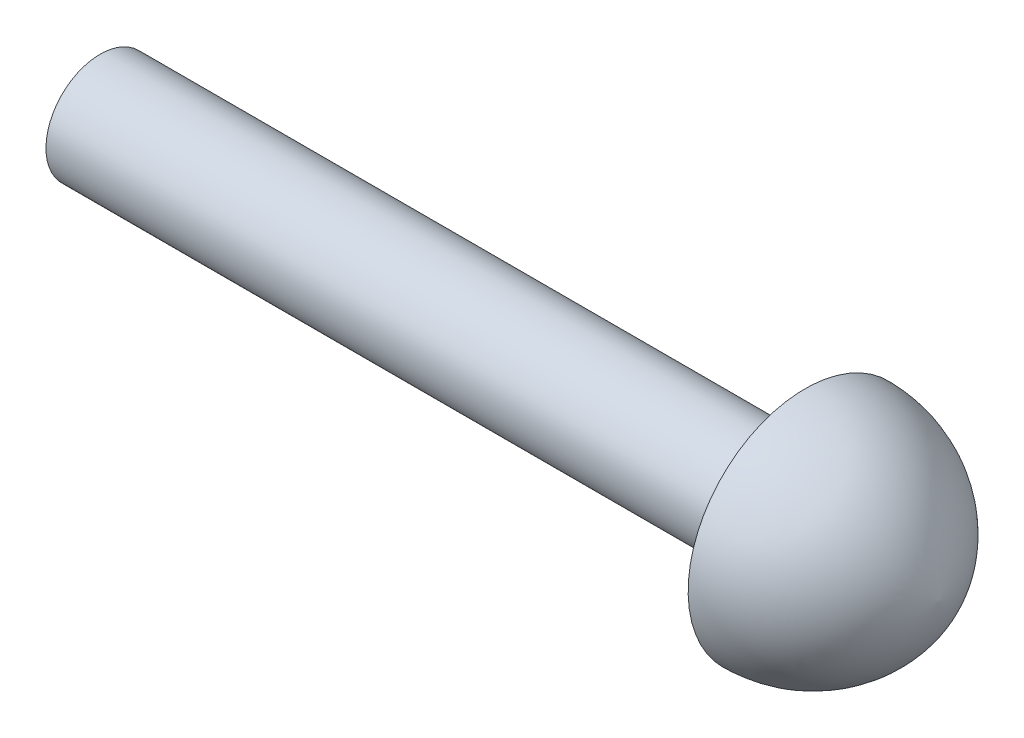
ISO-10303-21;
HEADER;
FILE_DESCRIPTION(('STEP AP214'),'2;1');
FILE_NAME('part.step','',(''),(''),'','','');
FILE_SCHEMA(('AUTOMOTIVE_DESIGN { 1 0 10303 214 1 1 1 1 }'));
ENDSEC;
DATA;
#1=APPLICATION_CONTEXT('core data for automotive mechanical design processes');
#2=APPLICATION_PROTOCOL_DEFINITION('international standard','automotive_design',2000,#1);
#3=PRODUCT_CONTEXT('',#1,'mechanical');
#4=PRODUCT('Part','Part','',(#3));
#5=PRODUCT_RELATED_PRODUCT_CATEGORY('part','',(#4));
#6=PRODUCT_DEFINITION_FORMATION('','',#4);
#7=PRODUCT_DEFINITION_CONTEXT('part definition',#1,'design');
#8=PRODUCT_DEFINITION('design','',#6,#7);
#9=PRODUCT_DEFINITION_SHAPE('','',#8);
#10=(LENGTH_UNIT() NAMED_UNIT(*) SI_UNIT(.MILLI.,.METRE.));
#11=(NAMED_UNIT(*) PLANE_ANGLE_UNIT() SI_UNIT($,.RADIAN.));
#12=(NAMED_UNIT(*) SI_UNIT($,.STERADIAN.) SOLID_ANGLE_UNIT());
#13=UNCERTAINTY_MEASURE_WITH_UNIT(LENGTH_MEASURE(1.E-05),#10,'distance_accuracy_value','');
#14=(GEOMETRIC_REPRESENTATION_CONTEXT(3) GLOBAL_UNCERTAINTY_ASSIGNED_CONTEXT((#13)) GLOBAL_UNIT_ASSIGNED_CONTEXT((#10,
#11,#12)) REPRESENTATION_CONTEXT('',''));
#15=CARTESIAN_POINT('',(0.,0.,0.));
#16=DIRECTION('',(0.,0.,1.));
#17=DIRECTION('',(1.,0.,0.));
#18=AXIS2_PLACEMENT_3D('',#15,#16,#17);
#19=CARTESIAN_POINT('',(0.,0.,0.));
#20=DIRECTION('',(1.,0.,0.));
#21=DIRECTION('',(0.,1.,0.));
#22=AXIS2_PLACEMENT_3D('',#19,#20,#21);
#23=PLANE('',#22);
#24=CARTESIAN_POINT('',(0.,0.,0.));
#25=DIRECTION('',(-1.,0.,0.));
#26=DIRECTION('',(0.,-1.,0.));
#27=AXIS2_PLACEMENT_3D('',#24,#25,#26);
#28=CIRCLE('',#27,2.);
#29=CARTESIAN_POINT('',(0.,-2.,0.));
#30=VERTEX_POINT('',#29);
#31=EDGE_CURVE('E11',#30,#30,#28,.T.);
#32=ORIENTED_EDGE('',*,*,#31,.T.);
#33=EDGE_LOOP('',(#32));
#34=FACE_BOUND('',#33,.T.);
#35=ADVANCED_FACE('F36',(#34),#23,.F.);
#36=CARTESIAN_POINT('',(0.,0.,0.));
#37=DIRECTION('',(-1.,0.,0.));
#38=DIRECTION('',(0.,-1.,0.));
#39=AXIS2_PLACEMENT_3D('',#36,#37,#38);
#40=CYLINDRICAL_SURFACE('',#39,2.);
#41=ORIENTED_EDGE('',*,*,#31,.F.);
#42=EDGE_LOOP('',(#41));
#43=FACE_BOUND('',#42,.T.);
#44=CARTESIAN_POINT('',(26.,0.,0.));
#45=DIRECTION('',(-1.,0.,0.));
#46=DIRECTION('',(0.,-1.,0.));
#47=AXIS2_PLACEMENT_3D('',#44,#45,#46);
#48=CIRCLE('',#47,2.);
#49=CARTESIAN_POINT('',(26.,-2.,0.));
#50=VERTEX_POINT('',#49);
#51=EDGE_CURVE('E42',#50,#50,#48,.T.);
#52=ORIENTED_EDGE('',*,*,#51,.T.);
#53=EDGE_LOOP('',(#52));
#54=FACE_BOUND('',#53,.T.);
#55=ADVANCED_FACE('F53',(#43,#54),#40,.T.);
#56=CARTESIAN_POINT('',(26.,2.,0.));
#57=DIRECTION('',(1.,0.,0.));
#58=DIRECTION('',(0.,1.,0.));
#59=AXIS2_PLACEMENT_3D('',#56,#57,#58);
#60=PLANE('',#59);
#61=ORIENTED_EDGE('',*,*,#51,.F.);
#62=EDGE_LOOP('',(#61));
#63=FACE_BOUND('',#62,.T.);
#64=CARTESIAN_POINT('',(26.,0.,0.));
#65=DIRECTION('',(-1.,0.,0.));
#66=DIRECTION('',(0.,-1.,0.));
#67=AXIS2_PLACEMENT_3D('',#64,#65,#66);
#68=CIRCLE('',#67,4.31192660550459);
#69=CARTESIAN_POINT('',(26.,-4.31192660550459,0.));
#70=VERTEX_POINT('',#69);
#71=EDGE_CURVE('E67',#70,#70,#68,.T.);
#72=ORIENTED_EDGE('',*,*,#71,.T.);
#73=EDGE_LOOP('',(#72));
#74=FACE_BOUND('',#73,.T.);
#75=ADVANCED_FACE('F47',(#63,#74),#60,.F.);
#76=CARTESIAN_POINT('',(26.,0.688073394495413,0.));
#77=DIRECTION('',(0.,0.,-1.));
#78=DIRECTION('',(0.,-1.,0.));
#79=AXIS2_PLACEMENT_3D('',#76,#77,#78);
#80=CIRCLE('',#79,5.);
#81=TRIMMED_CURVE('',#80,(PARAMETER_VALUE(-1.43274355085469)),
(PARAMETER_VALUE(1.43274355085469)),.T.,.PARAMETER.);
#82=CARTESIAN_POINT('',(26.,0.,0.));
#83=DIRECTION('',(-1.,0.,0.));
#84=AXIS1_PLACEMENT('',#82,#83);
#85=SURFACE_OF_REVOLUTION('',#81,#84);
#86=ORIENTED_EDGE('',*,*,#71,.F.);
#87=EDGE_LOOP('',(#86));
#88=FACE_BOUND('',#87,.T.);
#89=CARTESIAN_POINT('',(30.9524292022994,0.,0.));
#90=VERTEX_POINT('',#89);
#91=VERTEX_LOOP('',#90);
#92=FACE_BOUND('',#91,.T.);
#93=ADVANCED_FACE('F45',(#88,#92),#85,.T.);
#94=CLOSED_SHELL('',(#35,#55,#75,#93));
#95=MANIFOLD_SOLID_BREP('B2',#94);
#96=ADVANCED_BREP_SHAPE_REPRESENTATION('',(#18,#95),#14);
#97=SHAPE_DEFINITION_REPRESENTATION(#9,#96);
ENDSEC;
END-ISO-10303-21;
